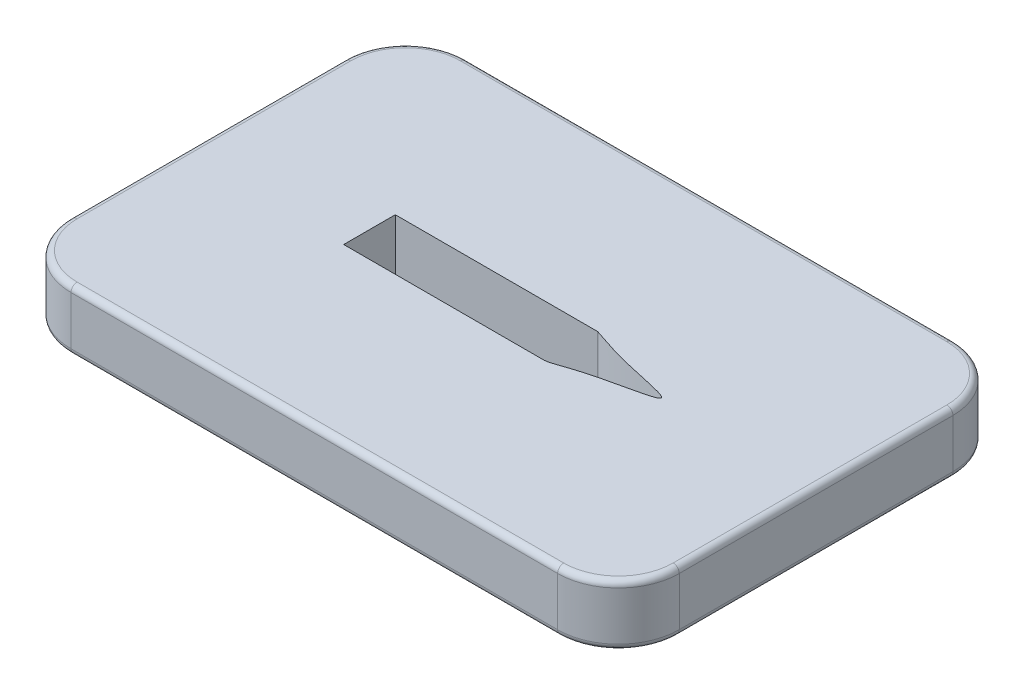
ISO-10303-21;
HEADER;
FILE_DESCRIPTION(('STEP AP214'),'2;1');
FILE_NAME('part.step','',(''),(''),'','','');
FILE_SCHEMA(('AUTOMOTIVE_DESIGN { 1 0 10303 214 1 1 1 1 }'));
ENDSEC;
DATA;
#1=APPLICATION_CONTEXT('core data for automotive mechanical design processes');
#2=APPLICATION_PROTOCOL_DEFINITION('international standard','automotive_design',2000,#1);
#3=PRODUCT_CONTEXT('',#1,'mechanical');
#4=PRODUCT('Part','Part','',(#3));
#5=PRODUCT_RELATED_PRODUCT_CATEGORY('part','',(#4));
#6=PRODUCT_DEFINITION_FORMATION('','',#4);
#7=PRODUCT_DEFINITION_CONTEXT('part definition',#1,'design');
#8=PRODUCT_DEFINITION('design','',#6,#7);
#9=PRODUCT_DEFINITION_SHAPE('','',#8);
#10=(LENGTH_UNIT() NAMED_UNIT(*) SI_UNIT(.MILLI.,.METRE.));
#11=(NAMED_UNIT(*) PLANE_ANGLE_UNIT() SI_UNIT($,.RADIAN.));
#12=(NAMED_UNIT(*) SI_UNIT($,.STERADIAN.) SOLID_ANGLE_UNIT());
#13=UNCERTAINTY_MEASURE_WITH_UNIT(LENGTH_MEASURE(1.E-05),#10,'distance_accuracy_value','');
#14=(GEOMETRIC_REPRESENTATION_CONTEXT(3) GLOBAL_UNCERTAINTY_ASSIGNED_CONTEXT((#13)) GLOBAL_UNIT_ASSIGNED_CONTEXT((#10,
#11,#12)) REPRESENTATION_CONTEXT('',''));
#15=CARTESIAN_POINT('',(0.,0.,0.));
#16=DIRECTION('',(0.,0.,1.));
#17=DIRECTION('',(1.,0.,0.));
#18=AXIS2_PLACEMENT_3D('',#15,#16,#17);
#19=CARTESIAN_POINT('',(-22.947041379712,10.,-16.4705882352941));
#20=DIRECTION('',(0.,-1.,0.));
#21=DIRECTION('',(0.,0.,-1.));
#22=AXIS2_PLACEMENT_3D('',#19,#20,#21);
#23=CYLINDRICAL_SURFACE('',#22,10.);
#24=DIRECTION('',(0.,-1.,0.));
#25=VECTOR('',#24,1.);
#26=CARTESIAN_POINT('',(-12.947041379712,10.,-16.470588235294));
#27=LINE('',#26,#25);
#28=CARTESIAN_POINT('',(-12.947041379712,9.,-16.470588235294));
#29=VERTEX_POINT('',#28);
#30=CARTESIAN_POINT('',(-12.947041379712,0.999999999999999,-16.470588235294));
#31=VERTEX_POINT('',#30);
#32=EDGE_CURVE('E482',#29,#31,#27,.T.);
#33=ORIENTED_EDGE('',*,*,#32,.T.);
#34=CARTESIAN_POINT('',(-22.947041379712,0.999999999999999,-16.4705882352941));
#35=DIRECTION('',(0.,-1.,0.));
#36=DIRECTION('',(0.,0.,-1.));
#37=AXIS2_PLACEMENT_3D('',#34,#35,#36);
#38=CIRCLE('',#37,10.);
#39=CARTESIAN_POINT('',(-22.9470413797121,0.999999999999999,-26.4705882352941));
#40=VERTEX_POINT('',#39);
#41=EDGE_CURVE('E408',#31,#40,#38,.F.);
#42=ORIENTED_EDGE('',*,*,#41,.T.);
#43=DIRECTION('',(0.,-1.,0.));
#44=VECTOR('',#43,1.);
#45=CARTESIAN_POINT('',(-22.9470413797121,10.,-26.4705882352941));
#46=LINE('',#45,#44);
#47=CARTESIAN_POINT('',(-22.9470413797121,9.,-26.4705882352941));
#48=VERTEX_POINT('',#47);
#49=EDGE_CURVE('E464',#48,#40,#46,.T.);
#50=ORIENTED_EDGE('',*,*,#49,.F.);
#51=CARTESIAN_POINT('',(-22.947041379712,9.,-16.4705882352941));
#52=DIRECTION('',(0.,-1.,0.));
#53=DIRECTION('',(0.,0.,-1.));
#54=AXIS2_PLACEMENT_3D('',#51,#52,#53);
#55=CIRCLE('',#54,10.);
#56=EDGE_CURVE('E436',#48,#29,#55,.T.);
#57=ORIENTED_EDGE('',*,*,#56,.T.);
#58=EDGE_LOOP('',(#33,#42,#50,#57));
#59=FACE_BOUND('',#58,.T.);
#60=ADVANCED_FACE('F44',(#59),#23,.T.);
#61=CARTESIAN_POINT('',(-102.947041379712,10.,-26.4705882352941));
#62=DIRECTION('',(0.,0.,1.));
#63=DIRECTION('',(1.,0.,0.));
#64=AXIS2_PLACEMENT_3D('',#61,#62,#63);
#65=PLANE('',#64);
#66=ORIENTED_EDGE('',*,*,#49,.T.);
#67=DIRECTION('',(-1.,0.,0.));
#68=VECTOR('',#67,1.);
#69=CARTESIAN_POINT('',(-102.947041379712,0.999999999999999,-26.4705882352941));
#70=LINE('',#69,#68);
#71=CARTESIAN_POINT('',(-102.947041379712,0.999999999999999,-26.4705882352941));
#72=VERTEX_POINT('',#71);
#73=EDGE_CURVE('E11',#40,#72,#70,.T.);
#74=ORIENTED_EDGE('',*,*,#73,.T.);
#75=DIRECTION('',(0.,-1.,0.));
#76=VECTOR('',#75,1.);
#77=CARTESIAN_POINT('',(-102.947041379712,10.,-26.4705882352941));
#78=LINE('',#77,#76);
#79=CARTESIAN_POINT('',(-102.947041379712,9.,-26.4705882352941));
#80=VERTEX_POINT('',#79);
#81=EDGE_CURVE('E466',#80,#72,#78,.T.);
#82=ORIENTED_EDGE('',*,*,#81,.F.);
#83=DIRECTION('',(-1.,0.,0.));
#84=VECTOR('',#83,1.);
#85=CARTESIAN_POINT('',(-102.947041379712,9.,-26.4705882352941));
#86=LINE('',#85,#84);
#87=EDGE_CURVE('E438',#80,#48,#86,.F.);
#88=ORIENTED_EDGE('',*,*,#87,.T.);
#89=EDGE_LOOP('',(#66,#74,#82,#88));
#90=FACE_BOUND('',#89,.T.);
#91=ADVANCED_FACE('F281',(#90),#65,.F.);
#92=CARTESIAN_POINT('',(-102.947041379712,10.,-16.4705882352941));
#93=DIRECTION('',(0.,-1.,0.));
#94=DIRECTION('',(0.,0.,-1.));
#95=AXIS2_PLACEMENT_3D('',#92,#93,#94);
#96=CYLINDRICAL_SURFACE('',#95,10.);
#97=ORIENTED_EDGE('',*,*,#81,.T.);
#98=CARTESIAN_POINT('',(-102.947041379712,0.999999999999999,-16.4705882352941));
#99=DIRECTION('',(0.,-1.,0.));
#100=DIRECTION('',(0.,0.,-1.));
#101=AXIS2_PLACEMENT_3D('',#98,#99,#100);
#102=CIRCLE('',#101,10.);
#103=CARTESIAN_POINT('',(-112.947041379712,0.999999999999999,-16.470588235294));
#104=VERTEX_POINT('',#103);
#105=EDGE_CURVE('E53',#72,#104,#102,.F.);
#106=ORIENTED_EDGE('',*,*,#105,.T.);
#107=DIRECTION('',(0.,-1.,0.));
#108=VECTOR('',#107,1.);
#109=CARTESIAN_POINT('',(-112.947041379712,10.,-16.470588235294));
#110=LINE('',#109,#108);
#111=CARTESIAN_POINT('',(-112.947041379712,9.,-16.470588235294));
#112=VERTEX_POINT('',#111);
#113=EDGE_CURVE('E468',#112,#104,#110,.T.);
#114=ORIENTED_EDGE('',*,*,#113,.F.);
#115=CARTESIAN_POINT('',(-102.947041379712,9.,-16.4705882352941));
#116=DIRECTION('',(0.,-1.,0.));
#117=DIRECTION('',(0.,0.,-1.));
#118=AXIS2_PLACEMENT_3D('',#115,#116,#117);
#119=CIRCLE('',#118,10.);
#120=EDGE_CURVE('E440',#112,#80,#119,.T.);
#121=ORIENTED_EDGE('',*,*,#120,.T.);
#122=EDGE_LOOP('',(#97,#106,#114,#121));
#123=FACE_BOUND('',#122,.T.);
#124=ADVANCED_FACE('F277',(#123),#96,.T.);
#125=CARTESIAN_POINT('',(-112.947041379712,10.,-16.470588235294));
#126=DIRECTION('',(1.,0.,0.));
#127=DIRECTION('',(0.,0.,-1.));
#128=AXIS2_PLACEMENT_3D('',#125,#126,#127);
#129=PLANE('',#128);
#130=ORIENTED_EDGE('',*,*,#113,.T.);
#131=DIRECTION('',(0.,0.,1.));
#132=VECTOR('',#131,1.);
#133=CARTESIAN_POINT('',(-112.947041379712,0.999999999999999,28.5294117647054));
#134=LINE('',#133,#132);
#135=CARTESIAN_POINT('',(-112.947041379712,0.999999999999999,28.5294117647054));
#136=VERTEX_POINT('',#135);
#137=EDGE_CURVE('E383',#104,#136,#134,.T.);
#138=ORIENTED_EDGE('',*,*,#137,.T.);
#139=DIRECTION('',(0.,-1.,0.));
#140=VECTOR('',#139,1.);
#141=CARTESIAN_POINT('',(-112.947041379712,10.,28.5294117647054));
#142=LINE('',#141,#140);
#143=CARTESIAN_POINT('',(-112.947041379712,9.,28.5294117647054));
#144=VERTEX_POINT('',#143);
#145=EDGE_CURVE('E470',#144,#136,#142,.T.);
#146=ORIENTED_EDGE('',*,*,#145,.F.);
#147=DIRECTION('',(0.,0.,1.));
#148=VECTOR('',#147,1.);
#149=CARTESIAN_POINT('',(-112.947041379712,9.,-16.470588235294));
#150=LINE('',#149,#148);
#151=EDGE_CURVE('E442',#144,#112,#150,.F.);
#152=ORIENTED_EDGE('',*,*,#151,.T.);
#153=EDGE_LOOP('',(#130,#138,#146,#152));
#154=FACE_BOUND('',#153,.T.);
#155=ADVANCED_FACE('F273',(#154),#129,.F.);
#156=CARTESIAN_POINT('',(-102.947041379712,10.,28.5294117647055));
#157=DIRECTION('',(0.,-1.,0.));
#158=DIRECTION('',(0.,0.,-1.));
#159=AXIS2_PLACEMENT_3D('',#156,#157,#158);
#160=CYLINDRICAL_SURFACE('',#159,10.);
#161=ORIENTED_EDGE('',*,*,#145,.T.);
#162=CARTESIAN_POINT('',(-102.947041379712,0.999999999999999,28.5294117647055));
#163=DIRECTION('',(0.,-1.,0.));
#164=DIRECTION('',(0.,0.,-1.));
#165=AXIS2_PLACEMENT_3D('',#162,#163,#164);
#166=CIRCLE('',#165,10.);
#167=CARTESIAN_POINT('',(-102.947041379712,0.999999999999999,38.5294117647055));
#168=VERTEX_POINT('',#167);
#169=EDGE_CURVE('E385',#136,#168,#166,.F.);
#170=ORIENTED_EDGE('',*,*,#169,.T.);
#171=DIRECTION('',(0.,-1.,0.));
#172=VECTOR('',#171,1.);
#173=CARTESIAN_POINT('',(-102.947041379712,10.,38.5294117647055));
#174=LINE('',#173,#172);
#175=CARTESIAN_POINT('',(-102.947041379712,9.,38.5294117647055));
#176=VERTEX_POINT('',#175);
#177=EDGE_CURVE('E473',#176,#168,#174,.T.);
#178=ORIENTED_EDGE('',*,*,#177,.F.);
#179=CARTESIAN_POINT('',(-102.947041379712,9.,28.5294117647055));
#180=DIRECTION('',(0.,-1.,0.));
#181=DIRECTION('',(0.,0.,-1.));
#182=AXIS2_PLACEMENT_3D('',#179,#180,#181);
#183=CIRCLE('',#182,10.);
#184=EDGE_CURVE('E444',#176,#144,#183,.T.);
#185=ORIENTED_EDGE('',*,*,#184,.T.);
#186=EDGE_LOOP('',(#161,#170,#178,#185));
#187=FACE_BOUND('',#186,.T.);
#188=ADVANCED_FACE('F269',(#187),#160,.T.);
#189=CARTESIAN_POINT('',(-102.947041379712,10.,38.5294117647055));
#190=DIRECTION('',(0.,0.,-1.));
#191=DIRECTION('',(-1.,0.,0.));
#192=AXIS2_PLACEMENT_3D('',#189,#190,#191);
#193=PLANE('',#192);
#194=ORIENTED_EDGE('',*,*,#177,.T.);
#195=DIRECTION('',(1.,0.,0.));
#196=VECTOR('',#195,1.);
#197=CARTESIAN_POINT('',(-22.9470413797121,0.999999999999999,38.5294117647055));
#198=LINE('',#197,#196);
#199=CARTESIAN_POINT('',(-22.9470413797121,0.999999999999999,38.5294117647055));
#200=VERTEX_POINT('',#199);
#201=EDGE_CURVE('E355',#168,#200,#198,.T.);
#202=ORIENTED_EDGE('',*,*,#201,.T.);
#203=DIRECTION('',(0.,-1.,0.));
#204=VECTOR('',#203,1.);
#205=CARTESIAN_POINT('',(-22.9470413797121,10.,38.5294117647055));
#206=LINE('',#205,#204);
#207=CARTESIAN_POINT('',(-22.9470413797121,9.,38.5294117647055));
#208=VERTEX_POINT('',#207);
#209=EDGE_CURVE('E476',#208,#200,#206,.T.);
#210=ORIENTED_EDGE('',*,*,#209,.F.);
#211=DIRECTION('',(1.,0.,0.));
#212=VECTOR('',#211,1.);
#213=CARTESIAN_POINT('',(-102.947041379712,9.,38.5294117647055));
#214=LINE('',#213,#212);
#215=EDGE_CURVE('E411',#208,#176,#214,.F.);
#216=ORIENTED_EDGE('',*,*,#215,.T.);
#217=EDGE_LOOP('',(#194,#202,#210,#216));
#218=FACE_BOUND('',#217,.T.);
#219=ADVANCED_FACE('F265',(#218),#193,.F.);
#220=CARTESIAN_POINT('',(-22.947041379712,10.,28.5294117647055));
#221=DIRECTION('',(0.,-1.,0.));
#222=DIRECTION('',(0.,0.,-1.));
#223=AXIS2_PLACEMENT_3D('',#220,#221,#222);
#224=CYLINDRICAL_SURFACE('',#223,10.);
#225=ORIENTED_EDGE('',*,*,#209,.T.);
#226=CARTESIAN_POINT('',(-22.947041379712,0.999999999999999,28.5294117647055));
#227=DIRECTION('',(0.,-1.,0.));
#228=DIRECTION('',(0.,0.,-1.));
#229=AXIS2_PLACEMENT_3D('',#226,#227,#228);
#230=CIRCLE('',#229,10.);
#231=CARTESIAN_POINT('',(-12.947041379712,0.999999999999999,28.5294117647054));
#232=VERTEX_POINT('',#231);
#233=EDGE_CURVE('E388',#200,#232,#230,.F.);
#234=ORIENTED_EDGE('',*,*,#233,.T.);
#235=DIRECTION('',(0.,-1.,0.));
#236=VECTOR('',#235,1.);
#237=CARTESIAN_POINT('',(-12.947041379712,10.,28.5294117647054));
#238=LINE('',#237,#236);
#239=CARTESIAN_POINT('',(-12.947041379712,9.,28.5294117647054));
#240=VERTEX_POINT('',#239);
#241=EDGE_CURVE('E479',#240,#232,#238,.T.);
#242=ORIENTED_EDGE('',*,*,#241,.F.);
#243=CARTESIAN_POINT('',(-22.947041379712,9.,28.5294117647055));
#244=DIRECTION('',(0.,-1.,0.));
#245=DIRECTION('',(0.,0.,-1.));
#246=AXIS2_PLACEMENT_3D('',#243,#244,#245);
#247=CIRCLE('',#246,10.);
#248=EDGE_CURVE('E432',#240,#208,#247,.T.);
#249=ORIENTED_EDGE('',*,*,#248,.T.);
#250=EDGE_LOOP('',(#225,#234,#242,#249));
#251=FACE_BOUND('',#250,.T.);
#252=ADVANCED_FACE('F261',(#251),#224,.T.);
#253=CARTESIAN_POINT('',(-12.947041379712,10.,-16.470588235294));
#254=DIRECTION('',(-1.,0.,0.));
#255=DIRECTION('',(0.,0.,1.));
#256=AXIS2_PLACEMENT_3D('',#253,#254,#255);
#257=PLANE('',#256);
#258=ORIENTED_EDGE('',*,*,#241,.T.);
#259=DIRECTION('',(0.,0.,-1.));
#260=VECTOR('',#259,1.);
#261=CARTESIAN_POINT('',(-12.947041379712,0.999999999999999,-16.470588235294));
#262=LINE('',#261,#260);
#263=EDGE_CURVE('E390',#232,#31,#262,.T.);
#264=ORIENTED_EDGE('',*,*,#263,.T.);
#265=ORIENTED_EDGE('',*,*,#32,.F.);
#266=DIRECTION('',(0.,0.,-1.));
#267=VECTOR('',#266,1.);
#268=CARTESIAN_POINT('',(-12.947041379712,9.,-16.470588235294));
#269=LINE('',#268,#267);
#270=EDGE_CURVE('E434',#29,#240,#269,.F.);
#271=ORIENTED_EDGE('',*,*,#270,.T.);
#272=EDGE_LOOP('',(#258,#264,#265,#271));
#273=FACE_BOUND('',#272,.T.);
#274=ADVANCED_FACE('F254',(#273),#257,.F.);
#275=CARTESIAN_POINT('',(-22.947041379712,10.,-16.4705882352941));
#276=DIRECTION('',(0.,-1.,0.));
#277=DIRECTION('',(0.,0.,-1.));
#278=AXIS2_PLACEMENT_3D('',#275,#276,#277);
#279=PLANE('',#278);
#280=DIRECTION('',(0.,0.,1.));
#281=VECTOR('',#280,1.);
#282=CARTESIAN_POINT('',(-111.947041379712,10.,-16.4705882352941));
#283=LINE('',#282,#281);
#284=CARTESIAN_POINT('',(-111.947041379712,10.,-16.470588235294));
#285=VERTEX_POINT('',#284);
#286=CARTESIAN_POINT('',(-111.947041379712,10.,28.5294117647054));
#287=VERTEX_POINT('',#286);
#288=EDGE_CURVE('E450',#285,#287,#283,.T.);
#289=ORIENTED_EDGE('',*,*,#288,.T.);
#290=CARTESIAN_POINT('',(-102.947041379712,10.,28.5294117647055));
#291=DIRECTION('',(0.,-1.,0.));
#292=DIRECTION('',(0.,0.,-1.));
#293=AXIS2_PLACEMENT_3D('',#290,#291,#292);
#294=CIRCLE('',#293,9.);
#295=CARTESIAN_POINT('',(-102.947041379712,10.,37.5294117647055));
#296=VERTEX_POINT('',#295);
#297=EDGE_CURVE('E447',#287,#296,#294,.F.);
#298=ORIENTED_EDGE('',*,*,#297,.T.);
#299=DIRECTION('',(1.,0.,0.));
#300=VECTOR('',#299,1.);
#301=CARTESIAN_POINT('',(-22.947041379712,10.,37.5294117647055));
#302=LINE('',#301,#300);
#303=CARTESIAN_POINT('',(-22.9470413797121,10.,37.5294117647055));
#304=VERTEX_POINT('',#303);
#305=EDGE_CURVE('E462',#296,#304,#302,.T.);
#306=ORIENTED_EDGE('',*,*,#305,.T.);
#307=CARTESIAN_POINT('',(-22.947041379712,10.,28.5294117647055));
#308=DIRECTION('',(0.,-1.,0.));
#309=DIRECTION('',(0.,0.,-1.));
#310=AXIS2_PLACEMENT_3D('',#307,#308,#309);
#311=CIRCLE('',#310,9.);
#312=CARTESIAN_POINT('',(-13.947041379712,10.,28.5294117647054));
#313=VERTEX_POINT('',#312);
#314=EDGE_CURVE('E460',#304,#313,#311,.F.);
#315=ORIENTED_EDGE('',*,*,#314,.T.);
#316=DIRECTION('',(0.,0.,-1.));
#317=VECTOR('',#316,1.);
#318=CARTESIAN_POINT('',(-13.947041379712,10.,-16.4705882352941));
#319=LINE('',#318,#317);
#320=CARTESIAN_POINT('',(-13.947041379712,10.,-16.470588235294));
#321=VERTEX_POINT('',#320);
#322=EDGE_CURVE('E458',#313,#321,#319,.T.);
#323=ORIENTED_EDGE('',*,*,#322,.T.);
#324=CARTESIAN_POINT('',(-22.947041379712,10.,-16.4705882352941));
#325=DIRECTION('',(0.,-1.,0.));
#326=DIRECTION('',(0.,0.,-1.));
#327=AXIS2_PLACEMENT_3D('',#324,#325,#326);
#328=CIRCLE('',#327,9.);
#329=CARTESIAN_POINT('',(-22.9470413797121,10.,-25.4705882352941));
#330=VERTEX_POINT('',#329);
#331=EDGE_CURVE('E456',#321,#330,#328,.F.);
#332=ORIENTED_EDGE('',*,*,#331,.T.);
#333=DIRECTION('',(-1.,0.,0.));
#334=VECTOR('',#333,1.);
#335=CARTESIAN_POINT('',(-22.947041379712,10.,-25.4705882352941));
#336=LINE('',#335,#334);
#337=CARTESIAN_POINT('',(-102.947041379712,10.,-25.4705882352941));
#338=VERTEX_POINT('',#337);
#339=EDGE_CURVE('E454',#330,#338,#336,.T.);
#340=ORIENTED_EDGE('',*,*,#339,.T.);
#341=CARTESIAN_POINT('',(-102.947041379712,10.,-16.4705882352941));
#342=DIRECTION('',(0.,-1.,0.));
#343=DIRECTION('',(0.,0.,-1.));
#344=AXIS2_PLACEMENT_3D('',#341,#342,#343);
#345=CIRCLE('',#344,9.);
#346=EDGE_CURVE('E452',#338,#285,#345,.F.);
#347=ORIENTED_EDGE('',*,*,#346,.T.);
#348=EDGE_LOOP('',(#289,#298,#306,#315,#323,#332,#340,#347));
#349=FACE_BOUND('',#348,.T.);
#350=DIRECTION('',(1.,0.,0.));
#351=VECTOR('',#350,1.);
#352=CARTESIAN_POINT('',(-86.3741512636771,10.,10.2732965921658));
#353=LINE('',#352,#351);
#354=CARTESIAN_POINT('',(-86.3741512636771,10.,10.2732965921658));
#355=VERTEX_POINT('',#354);
#356=CARTESIAN_POINT('',(-53.4231390678876,10.,10.2732965921658));
#357=VERTEX_POINT('',#356);
#358=EDGE_CURVE('E514',#355,#357,#353,.T.);
#359=ORIENTED_EDGE('',*,*,#358,.F.);
#360=DIRECTION('',(0.,0.,1.));
#361=VECTOR('',#360,1.);
#362=CARTESIAN_POINT('',(-86.3741512636771,10.,1.78552694124163));
#363=LINE('',#362,#361);
#364=CARTESIAN_POINT('',(-86.3741512636771,10.,1.78552694124163));
#365=VERTEX_POINT('',#364);
#366=EDGE_CURVE('E202',#365,#355,#363,.T.);
#367=ORIENTED_EDGE('',*,*,#366,.F.);
#368=DIRECTION('',(1.,0.,0.));
#369=VECTOR('',#368,1.);
#370=CARTESIAN_POINT('',(-86.3741512636771,10.,1.78552694124163));
#371=LINE('',#370,#369);
#372=CARTESIAN_POINT('',(-53.1559115649607,10.,1.78552694124163));
#373=VERTEX_POINT('',#372);
#374=EDGE_CURVE('E219',#365,#373,#371,.T.);
#375=ORIENTED_EDGE('',*,*,#374,.T.);
#376=CARTESIAN_POINT('',(-53.1559115649607,10.,1.78552694124163));
#377=CARTESIAN_POINT('',(-53.129080982494,10.,1.78938008632672));
#378=CARTESIAN_POINT('',(-53.1023158995604,10.,1.79328134778608));
#379=CARTESIAN_POINT('',(-53.0756073418984,10.,1.79723120744067));
#380=B_SPLINE_CURVE_WITH_KNOTS('',3,(#376,#377,#378,#379),.UNSPECIFIED.,.F.,.F.,(4,4),(0.,
0.000996400117936327),.UNSPECIFIED.);
#381=CARTESIAN_POINT('',(-53.0756073418984,10.,1.79723120744067));
#382=VERTEX_POINT('',#381);
#383=EDGE_CURVE('E222',#373,#382,#380,.T.);
#384=ORIENTED_EDGE('',*,*,#383,.T.);
#385=CARTESIAN_POINT('',(-53.0756073418984,10.,1.79723120744067));
#386=CARTESIAN_POINT('',(-51.5414857041665,10.,2.31674032644246));
#387=CARTESIAN_POINT('',(-45.4156020228323,10.,4.42244429270034));
#388=CARTESIAN_POINT('',(-33.3212391013097,10.,6.01523887983662));
#389=CARTESIAN_POINT('',(-45.2495627145046,10.,7.63943210245453));
#390=CARTESIAN_POINT('',(-51.251453322403,10.,9.67846550374859));
#391=CARTESIAN_POINT('',(-52.6935705394928,10.,10.167430321721));
#392=B_SPLINE_CURVE_WITH_KNOTS('',3,(#385,#386,#387,#388,#389,#390,#391),.UNSPECIFIED.,.F.,.F.,
(4,1,1,1,4),(0.,0.0633445722577171,0.236845360334493,0.409375210494384,0.468351291668037),.UNSPECIFIED.);
#393=CARTESIAN_POINT('',(-52.6935705394928,10.,10.167430321721));
#394=VERTEX_POINT('',#393);
#395=EDGE_CURVE('E498',#382,#394,#392,.T.);
#396=ORIENTED_EDGE('',*,*,#395,.T.);
#397=CARTESIAN_POINT('',(-52.6935705394928,10.,10.167430321721));
#398=CARTESIAN_POINT('',(-52.9330802293146,10.,10.2067332113804));
#399=CARTESIAN_POINT('',(-53.1753723895579,10.,10.242094783313));
#400=CARTESIAN_POINT('',(-53.4231390678876,10.,10.2732965921658));
#401=B_SPLINE_CURVE_WITH_KNOTS('',3,(#397,#398,#399,#400),.UNSPECIFIED.,.F.,.F.,(4,4),
(0.314143829827868,0.323514460727352),.UNSPECIFIED.);
#402=EDGE_CURVE('E506',#394,#357,#401,.T.);
#403=ORIENTED_EDGE('',*,*,#402,.T.);
#404=EDGE_LOOP('',(#359,#367,#375,#384,#396,#403));
#405=FACE_BOUND('',#404,.T.);
#406=ADVANCED_FACE('F251',(#349,#405),#279,.F.);
#407=CARTESIAN_POINT('',(-22.947041379712,0.,-16.4705882352941));
#408=DIRECTION('',(0.,-1.,0.));
#409=DIRECTION('',(0.,0.,-1.));
#410=AXIS2_PLACEMENT_3D('',#407,#408,#409);
#411=PLANE('',#410);
#412=DIRECTION('',(-1.,0.,0.));
#413=VECTOR('',#412,1.);
#414=CARTESIAN_POINT('',(-22.9470413797121,0.,-25.4705882352941));
#415=LINE('',#414,#413);
#416=CARTESIAN_POINT('',(-102.947041379712,0.,-25.4705882352941));
#417=VERTEX_POINT('',#416);
#418=CARTESIAN_POINT('',(-22.9470413797121,0.,-25.4705882352941));
#419=VERTEX_POINT('',#418);
#420=EDGE_CURVE('E406',#417,#419,#415,.F.);
#421=ORIENTED_EDGE('',*,*,#420,.T.);
#422=CARTESIAN_POINT('',(-22.947041379712,0.,-16.4705882352941));
#423=DIRECTION('',(0.,-1.,0.));
#424=DIRECTION('',(0.,0.,-1.));
#425=AXIS2_PLACEMENT_3D('',#422,#423,#424);
#426=CIRCLE('',#425,9.);
#427=CARTESIAN_POINT('',(-13.947041379712,0.,-16.470588235294));
#428=VERTEX_POINT('',#427);
#429=EDGE_CURVE('E392',#419,#428,#426,.T.);
#430=ORIENTED_EDGE('',*,*,#429,.T.);
#431=DIRECTION('',(0.,0.,-1.));
#432=VECTOR('',#431,1.);
#433=CARTESIAN_POINT('',(-13.947041379712,0.,28.5294117647054));
#434=LINE('',#433,#432);
#435=CARTESIAN_POINT('',(-13.947041379712,0.,28.5294117647054));
#436=VERTEX_POINT('',#435);
#437=EDGE_CURVE('E395',#428,#436,#434,.F.);
#438=ORIENTED_EDGE('',*,*,#437,.T.);
#439=CARTESIAN_POINT('',(-22.947041379712,0.,28.5294117647055));
#440=DIRECTION('',(0.,-1.,0.));
#441=DIRECTION('',(0.,0.,-1.));
#442=AXIS2_PLACEMENT_3D('',#439,#440,#441);
#443=CIRCLE('',#442,9.);
#444=CARTESIAN_POINT('',(-22.9470413797121,0.,37.5294117647055));
#445=VERTEX_POINT('',#444);
#446=EDGE_CURVE('E397',#436,#445,#443,.T.);
#447=ORIENTED_EDGE('',*,*,#446,.T.);
#448=DIRECTION('',(1.,0.,0.));
#449=VECTOR('',#448,1.);
#450=CARTESIAN_POINT('',(-102.947041379712,0.,37.5294117647055));
#451=LINE('',#450,#449);
#452=CARTESIAN_POINT('',(-102.947041379712,0.,37.5294117647055));
#453=VERTEX_POINT('',#452);
#454=EDGE_CURVE('E353',#445,#453,#451,.F.);
#455=ORIENTED_EDGE('',*,*,#454,.T.);
#456=CARTESIAN_POINT('',(-102.947041379712,0.,28.5294117647055));
#457=DIRECTION('',(0.,-1.,0.));
#458=DIRECTION('',(0.,0.,-1.));
#459=AXIS2_PLACEMENT_3D('',#456,#457,#458);
#460=CIRCLE('',#459,9.);
#461=CARTESIAN_POINT('',(-111.947041379712,0.,28.5294117647054));
#462=VERTEX_POINT('',#461);
#463=EDGE_CURVE('E400',#453,#462,#460,.T.);
#464=ORIENTED_EDGE('',*,*,#463,.T.);
#465=DIRECTION('',(0.,0.,1.));
#466=VECTOR('',#465,1.);
#467=CARTESIAN_POINT('',(-111.947041379712,0.,-16.470588235294));
#468=LINE('',#467,#466);
#469=CARTESIAN_POINT('',(-111.947041379712,0.,-16.470588235294));
#470=VERTEX_POINT('',#469);
#471=EDGE_CURVE('E402',#462,#470,#468,.F.);
#472=ORIENTED_EDGE('',*,*,#471,.T.);
#473=CARTESIAN_POINT('',(-102.947041379712,0.,-16.4705882352941));
#474=DIRECTION('',(0.,-1.,0.));
#475=DIRECTION('',(0.,0.,-1.));
#476=AXIS2_PLACEMENT_3D('',#473,#474,#475);
#477=CIRCLE('',#476,9.);
#478=EDGE_CURVE('E404',#470,#417,#477,.T.);
#479=ORIENTED_EDGE('',*,*,#478,.T.);
#480=EDGE_LOOP('',(#421,#430,#438,#447,#455,#464,#472,#479));
#481=FACE_BOUND('',#480,.T.);
#482=DIRECTION('',(0.,0.,1.));
#483=VECTOR('',#482,1.);
#484=CARTESIAN_POINT('',(-86.3741512636771,0.,1.78552694124163));
#485=LINE('',#484,#483);
#486=CARTESIAN_POINT('',(-86.3741512636771,0.,1.78552694124163));
#487=VERTEX_POINT('',#486);
#488=CARTESIAN_POINT('',(-86.3741512636771,0.,10.2732965921658));
#489=VERTEX_POINT('',#488);
#490=EDGE_CURVE('E199',#487,#489,#485,.T.);
#491=ORIENTED_EDGE('',*,*,#490,.T.);
#492=DIRECTION('',(1.,0.,0.));
#493=VECTOR('',#492,1.);
#494=CARTESIAN_POINT('',(-86.3741512636771,0.,10.2732965921658));
#495=LINE('',#494,#493);
#496=CARTESIAN_POINT('',(-53.4231390678876,0.,10.2732965921658));
#497=VERTEX_POINT('',#496);
#498=EDGE_CURVE('E210',#489,#497,#495,.T.);
#499=ORIENTED_EDGE('',*,*,#498,.T.);
#500=CARTESIAN_POINT('',(-52.6935705394928,0.,10.167430321721));
#501=CARTESIAN_POINT('',(-52.9330802293146,0.,10.2067332113804));
#502=CARTESIAN_POINT('',(-53.1753723895579,0.,10.242094783313));
#503=CARTESIAN_POINT('',(-53.4231390678876,0.,10.2732965921658));
#504=B_SPLINE_CURVE_WITH_KNOTS('',3,(#500,#501,#502,#503),.UNSPECIFIED.,.F.,.F.,(4,4),
(0.314143829827868,0.323514460727352),.UNSPECIFIED.);
#505=CARTESIAN_POINT('',(-52.6935705394928,0.,10.167430321721));
#506=VERTEX_POINT('',#505);
#507=EDGE_CURVE('E215',#506,#497,#504,.T.);
#508=ORIENTED_EDGE('',*,*,#507,.F.);
#509=CARTESIAN_POINT('',(-53.0756073418984,0.,1.79723120744067));
#510=CARTESIAN_POINT('',(-51.5414857041665,0.,2.31674032644246));
#511=CARTESIAN_POINT('',(-45.4156020228323,0.,4.42244429270034));
#512=CARTESIAN_POINT('',(-33.3212391013097,0.,6.01523887983662));
#513=CARTESIAN_POINT('',(-45.2495627145046,0.,7.63943210245453));
#514=CARTESIAN_POINT('',(-51.251453322403,0.,9.67846550374859));
#515=CARTESIAN_POINT('',(-52.6935705394928,0.,10.167430321721));
#516=B_SPLINE_CURVE_WITH_KNOTS('',3,(#509,#510,#511,#512,#513,#514,#515),.UNSPECIFIED.,.F.,.F.,
(4,1,1,1,4),(0.,0.0633445722577171,0.236845360334493,0.409375210494384,0.468351291668037),.UNSPECIFIED.);
#517=CARTESIAN_POINT('',(-53.0756073418984,0.,1.79723120744067));
#518=VERTEX_POINT('',#517);
#519=EDGE_CURVE('E229',#518,#506,#516,.T.);
#520=ORIENTED_EDGE('',*,*,#519,.F.);
#521=CARTESIAN_POINT('',(-53.1559115649607,0.,1.78552694124163));
#522=CARTESIAN_POINT('',(-53.129080982494,0.,1.78938008632672));
#523=CARTESIAN_POINT('',(-53.1023158995604,0.,1.79328134778608));
#524=CARTESIAN_POINT('',(-53.0756073418984,0.,1.79723120744067));
#525=B_SPLINE_CURVE_WITH_KNOTS('',3,(#521,#522,#523,#524),.UNSPECIFIED.,.F.,.F.,(4,4),(0.,
0.000996400117936327),.UNSPECIFIED.);
#526=CARTESIAN_POINT('',(-53.1559115649607,0.,1.78552694124163));
#527=VERTEX_POINT('',#526);
#528=EDGE_CURVE('E520',#527,#518,#525,.T.);
#529=ORIENTED_EDGE('',*,*,#528,.F.);
#530=DIRECTION('',(1.,0.,0.));
#531=VECTOR('',#530,1.);
#532=CARTESIAN_POINT('',(-86.3741512636771,0.,1.78552694124163));
#533=LINE('',#532,#531);
#534=EDGE_CURVE('E207',#487,#527,#533,.T.);
#535=ORIENTED_EDGE('',*,*,#534,.F.);
#536=EDGE_LOOP('',(#491,#499,#508,#520,#529,#535));
#537=FACE_BOUND('',#536,.T.);
#538=ADVANCED_FACE('F217',(#481,#537),#411,.T.);
#539=CARTESIAN_POINT('',(-86.3741512636771,0.,1.78552694124163));
#540=DIRECTION('',(-1.,0.,0.));
#541=DIRECTION('',(0.,0.,1.));
#542=AXIS2_PLACEMENT_3D('',#539,#540,#541);
#543=PLANE('',#542);
#544=ORIENTED_EDGE('',*,*,#366,.T.);
#545=DIRECTION('',(0.,1.,0.));
#546=VECTOR('',#545,1.);
#547=CARTESIAN_POINT('',(-86.3741512636771,0.,10.2732965921658));
#548=LINE('',#547,#546);
#549=EDGE_CURVE('E195',#489,#355,#548,.T.);
#550=ORIENTED_EDGE('',*,*,#549,.F.);
#551=ORIENTED_EDGE('',*,*,#490,.F.);
#552=DIRECTION('',(0.,1.,0.));
#553=VECTOR('',#552,1.);
#554=CARTESIAN_POINT('',(-86.3741512636771,0.,1.78552694124163));
#555=LINE('',#554,#553);
#556=EDGE_CURVE('E484',#487,#365,#555,.T.);
#557=ORIENTED_EDGE('',*,*,#556,.T.);
#558=EDGE_LOOP('',(#544,#550,#551,#557));
#559=FACE_BOUND('',#558,.T.);
#560=ADVANCED_FACE('F197',(#559),#543,.F.);
#561=CARTESIAN_POINT('',(-86.3741512636771,0.,1.78552694124163));
#562=DIRECTION('',(0.,0.,1.));
#563=DIRECTION('',(1.,0.,0.));
#564=AXIS2_PLACEMENT_3D('',#561,#562,#563);
#565=PLANE('',#564);
#566=ORIENTED_EDGE('',*,*,#374,.F.);
#567=ORIENTED_EDGE('',*,*,#556,.F.);
#568=ORIENTED_EDGE('',*,*,#534,.T.);
#569=DIRECTION('',(0.,1.,0.));
#570=VECTOR('',#569,1.);
#571=CARTESIAN_POINT('',(-53.1559115649607,0.,1.78552694124163));
#572=LINE('',#571,#570);
#573=EDGE_CURVE('E491',#527,#373,#572,.T.);
#574=ORIENTED_EDGE('',*,*,#573,.T.);
#575=EDGE_LOOP('',(#566,#567,#568,#574));
#576=FACE_BOUND('',#575,.T.);
#577=ADVANCED_FACE('F250',(#576),#565,.T.);
#578=DIRECTION('',(0.,1.,0.));
#579=VECTOR('',#578,1.);
#580=SURFACE_OF_LINEAR_EXTRUSION('',#525,#579);
#581=ORIENTED_EDGE('',*,*,#383,.F.);
#582=ORIENTED_EDGE('',*,*,#573,.F.);
#583=ORIENTED_EDGE('',*,*,#528,.T.);
#584=DIRECTION('',(0.,1.,0.));
#585=VECTOR('',#584,1.);
#586=CARTESIAN_POINT('',(-53.0756073418984,0.,1.79723120744067));
#587=LINE('',#586,#585);
#588=EDGE_CURVE('E489',#518,#382,#587,.T.);
#589=ORIENTED_EDGE('',*,*,#588,.T.);
#590=EDGE_LOOP('',(#581,#582,#583,#589));
#591=FACE_BOUND('',#590,.T.);
#592=ADVANCED_FACE('F527',(#591),#580,.T.);
#593=DIRECTION('',(0.,1.,0.));
#594=VECTOR('',#593,1.);
#595=SURFACE_OF_LINEAR_EXTRUSION('',#516,#594);
#596=ORIENTED_EDGE('',*,*,#395,.F.);
#597=ORIENTED_EDGE('',*,*,#588,.F.);
#598=ORIENTED_EDGE('',*,*,#519,.T.);
#599=DIRECTION('',(0.,1.,0.));
#600=VECTOR('',#599,1.);
#601=CARTESIAN_POINT('',(-52.6935705394928,0.,10.167430321721));
#602=LINE('',#601,#600);
#603=EDGE_CURVE('E487',#506,#394,#602,.T.);
#604=ORIENTED_EDGE('',*,*,#603,.T.);
#605=EDGE_LOOP('',(#596,#597,#598,#604));
#606=FACE_BOUND('',#605,.T.);
#607=ADVANCED_FACE('F242',(#606),#595,.T.);
#608=DIRECTION('',(0.,1.,0.));
#609=VECTOR('',#608,1.);
#610=SURFACE_OF_LINEAR_EXTRUSION('',#504,#609);
#611=ORIENTED_EDGE('',*,*,#402,.F.);
#612=ORIENTED_EDGE('',*,*,#603,.F.);
#613=ORIENTED_EDGE('',*,*,#507,.T.);
#614=DIRECTION('',(0.,1.,0.));
#615=VECTOR('',#614,1.);
#616=CARTESIAN_POINT('',(-53.4231390678876,0.,10.2732965921658));
#617=LINE('',#616,#615);
#618=EDGE_CURVE('E206',#497,#357,#617,.T.);
#619=ORIENTED_EDGE('',*,*,#618,.T.);
#620=EDGE_LOOP('',(#611,#612,#613,#619));
#621=FACE_BOUND('',#620,.T.);
#622=ADVANCED_FACE('F238',(#621),#610,.T.);
#623=CARTESIAN_POINT('',(-86.3741512636771,0.,10.2732965921658));
#624=DIRECTION('',(0.,0.,1.));
#625=DIRECTION('',(1.,0.,0.));
#626=AXIS2_PLACEMENT_3D('',#623,#624,#625);
#627=PLANE('',#626);
#628=ORIENTED_EDGE('',*,*,#358,.T.);
#629=ORIENTED_EDGE('',*,*,#618,.F.);
#630=ORIENTED_EDGE('',*,*,#498,.F.);
#631=ORIENTED_EDGE('',*,*,#549,.T.);
#632=EDGE_LOOP('',(#628,#629,#630,#631));
#633=FACE_BOUND('',#632,.T.);
#634=ADVANCED_FACE('F211',(#633),#627,.F.);
#635=CARTESIAN_POINT('',(-22.947041379712,9.,-16.4705882352941));
#636=DIRECTION('',(0.,-1.,0.));
#637=DIRECTION('',(0.,0.,-1.));
#638=AXIS2_PLACEMENT_3D('',#635,#636,#637);
#639=TOROIDAL_SURFACE('',#638,9.,1.);
#640=CARTESIAN_POINT('',(-13.947041379712,9.,-16.470588235294));
#641=DIRECTION('',(0.,0.,1.));
#642=DIRECTION('',(1.,0.,0.));
#643=AXIS2_PLACEMENT_3D('',#640,#641,#642);
#644=CIRCLE('',#643,1.);
#645=EDGE_CURVE('E415',#29,#321,#644,.T.);
#646=ORIENTED_EDGE('',*,*,#645,.F.);
#647=ORIENTED_EDGE('',*,*,#56,.F.);
#648=CARTESIAN_POINT('',(-22.9470413797121,9.,-25.4705882352941));
#649=DIRECTION('',(-1.,0.,0.));
#650=DIRECTION('',(0.,0.,1.));
#651=AXIS2_PLACEMENT_3D('',#648,#649,#650);
#652=CIRCLE('',#651,1.);
#653=EDGE_CURVE('E412',#330,#48,#652,.T.);
#654=ORIENTED_EDGE('',*,*,#653,.F.);
#655=ORIENTED_EDGE('',*,*,#331,.F.);
#656=EDGE_LOOP('',(#646,#647,#654,#655));
#657=FACE_BOUND('',#656,.T.);
#658=ADVANCED_FACE('F247',(#657),#639,.T.);
#659=CARTESIAN_POINT('',(-22.947041379712,9.,-25.4705882352941));
#660=DIRECTION('',(-1.,0.,0.));
#661=DIRECTION('',(0.,0.,1.));
#662=AXIS2_PLACEMENT_3D('',#659,#660,#661);
#663=CYLINDRICAL_SURFACE('',#662,1.);
#664=ORIENTED_EDGE('',*,*,#653,.T.);
#665=ORIENTED_EDGE('',*,*,#87,.F.);
#666=CARTESIAN_POINT('',(-102.947041379712,9.,-25.4705882352941));
#667=DIRECTION('',(-1.,0.,0.));
#668=DIRECTION('',(0.,0.,1.));
#669=AXIS2_PLACEMENT_3D('',#666,#667,#668);
#670=CIRCLE('',#669,1.);
#671=EDGE_CURVE('E418',#338,#80,#670,.T.);
#672=ORIENTED_EDGE('',*,*,#671,.F.);
#673=ORIENTED_EDGE('',*,*,#339,.F.);
#674=EDGE_LOOP('',(#664,#665,#672,#673));
#675=FACE_BOUND('',#674,.T.);
#676=ADVANCED_FACE('F310',(#675),#663,.T.);
#677=CARTESIAN_POINT('',(-13.947041379712,9.,-16.4705882352941));
#678=DIRECTION('',(0.,0.,-1.));
#679=DIRECTION('',(-1.,0.,0.));
#680=AXIS2_PLACEMENT_3D('',#677,#678,#679);
#681=CYLINDRICAL_SURFACE('',#680,1.);
#682=ORIENTED_EDGE('',*,*,#645,.T.);
#683=ORIENTED_EDGE('',*,*,#322,.F.);
#684=CARTESIAN_POINT('',(-13.947041379712,9.,28.5294117647054));
#685=DIRECTION('',(0.,0.,1.));
#686=DIRECTION('',(1.,0.,0.));
#687=AXIS2_PLACEMENT_3D('',#684,#685,#686);
#688=CIRCLE('',#687,1.);
#689=EDGE_CURVE('E421',#240,#313,#688,.T.);
#690=ORIENTED_EDGE('',*,*,#689,.F.);
#691=ORIENTED_EDGE('',*,*,#270,.F.);
#692=EDGE_LOOP('',(#682,#683,#690,#691));
#693=FACE_BOUND('',#692,.T.);
#694=ADVANCED_FACE('F306',(#693),#681,.T.);
#695=CARTESIAN_POINT('',(-102.947041379712,9.,-16.4705882352941));
#696=DIRECTION('',(0.,-1.,0.));
#697=DIRECTION('',(0.,0.,-1.));
#698=AXIS2_PLACEMENT_3D('',#695,#696,#697);
#699=TOROIDAL_SURFACE('',#698,9.,1.);
#700=ORIENTED_EDGE('',*,*,#671,.T.);
#701=ORIENTED_EDGE('',*,*,#120,.F.);
#702=CARTESIAN_POINT('',(-111.947041379712,9.,-16.470588235294));
#703=DIRECTION('',(0.,0.,1.));
#704=DIRECTION('',(1.,0.,0.));
#705=AXIS2_PLACEMENT_3D('',#702,#703,#704);
#706=CIRCLE('',#705,1.);
#707=EDGE_CURVE('E424',#285,#112,#706,.T.);
#708=ORIENTED_EDGE('',*,*,#707,.F.);
#709=ORIENTED_EDGE('',*,*,#346,.F.);
#710=EDGE_LOOP('',(#700,#701,#708,#709));
#711=FACE_BOUND('',#710,.T.);
#712=ADVANCED_FACE('F302',(#711),#699,.T.);
#713=CARTESIAN_POINT('',(-22.947041379712,9.,28.5294117647055));
#714=DIRECTION('',(0.,-1.,0.));
#715=DIRECTION('',(0.,0.,-1.));
#716=AXIS2_PLACEMENT_3D('',#713,#714,#715);
#717=TOROIDAL_SURFACE('',#716,9.,1.);
#718=ORIENTED_EDGE('',*,*,#689,.T.);
#719=ORIENTED_EDGE('',*,*,#314,.F.);
#720=CARTESIAN_POINT('',(-22.9470413797121,9.,37.5294117647055));
#721=DIRECTION('',(-1.,0.,0.));
#722=DIRECTION('',(0.,0.,1.));
#723=AXIS2_PLACEMENT_3D('',#720,#721,#722);
#724=CIRCLE('',#723,1.);
#725=EDGE_CURVE('E427',#208,#304,#724,.T.);
#726=ORIENTED_EDGE('',*,*,#725,.F.);
#727=ORIENTED_EDGE('',*,*,#248,.F.);
#728=EDGE_LOOP('',(#718,#719,#726,#727));
#729=FACE_BOUND('',#728,.T.);
#730=ADVANCED_FACE('F298',(#729),#717,.T.);
#731=CARTESIAN_POINT('',(-111.947041379712,9.,-16.4705882352941));
#732=DIRECTION('',(0.,0.,1.));
#733=DIRECTION('',(1.,0.,0.));
#734=AXIS2_PLACEMENT_3D('',#731,#732,#733);
#735=CYLINDRICAL_SURFACE('',#734,1.);
#736=ORIENTED_EDGE('',*,*,#707,.T.);
#737=ORIENTED_EDGE('',*,*,#151,.F.);
#738=CARTESIAN_POINT('',(-111.947041379712,9.,28.5294117647054));
#739=DIRECTION('',(0.,0.,1.));
#740=DIRECTION('',(1.,0.,0.));
#741=AXIS2_PLACEMENT_3D('',#738,#739,#740);
#742=CIRCLE('',#741,1.);
#743=EDGE_CURVE('E360',#287,#144,#742,.T.);
#744=ORIENTED_EDGE('',*,*,#743,.F.);
#745=ORIENTED_EDGE('',*,*,#288,.F.);
#746=EDGE_LOOP('',(#736,#737,#744,#745));
#747=FACE_BOUND('',#746,.T.);
#748=ADVANCED_FACE('F294',(#747),#735,.T.);
#749=CARTESIAN_POINT('',(-22.947041379712,9.,37.5294117647055));
#750=DIRECTION('',(1.,0.,0.));
#751=DIRECTION('',(0.,0.,-1.));
#752=AXIS2_PLACEMENT_3D('',#749,#750,#751);
#753=CYLINDRICAL_SURFACE('',#752,1.);
#754=ORIENTED_EDGE('',*,*,#725,.T.);
#755=ORIENTED_EDGE('',*,*,#305,.F.);
#756=CARTESIAN_POINT('',(-102.947041379712,9.,37.5294117647055));
#757=DIRECTION('',(-1.,0.,0.));
#758=DIRECTION('',(0.,0.,1.));
#759=AXIS2_PLACEMENT_3D('',#756,#757,#758);
#760=CIRCLE('',#759,1.);
#761=EDGE_CURVE('E358',#176,#296,#760,.T.);
#762=ORIENTED_EDGE('',*,*,#761,.F.);
#763=ORIENTED_EDGE('',*,*,#215,.F.);
#764=EDGE_LOOP('',(#754,#755,#762,#763));
#765=FACE_BOUND('',#764,.T.);
#766=ADVANCED_FACE('F290',(#765),#753,.T.);
#767=CARTESIAN_POINT('',(-102.947041379712,9.,28.5294117647055));
#768=DIRECTION('',(0.,-1.,0.));
#769=DIRECTION('',(0.,0.,-1.));
#770=AXIS2_PLACEMENT_3D('',#767,#768,#769);
#771=TOROIDAL_SURFACE('',#770,9.,1.);
#772=ORIENTED_EDGE('',*,*,#743,.T.);
#773=ORIENTED_EDGE('',*,*,#184,.F.);
#774=ORIENTED_EDGE('',*,*,#761,.T.);
#775=ORIENTED_EDGE('',*,*,#297,.F.);
#776=EDGE_LOOP('',(#772,#773,#774,#775));
#777=FACE_BOUND('',#776,.T.);
#778=ADVANCED_FACE('F287',(#777),#771,.T.);
#779=CARTESIAN_POINT('',(-102.947041379712,0.999999999999999,28.5294117647055));
#780=DIRECTION('',(0.,-1.,0.));
#781=DIRECTION('',(0.,0.,-1.));
#782=AXIS2_PLACEMENT_3D('',#779,#780,#781);
#783=TOROIDAL_SURFACE('',#782,9.,1.);
#784=CARTESIAN_POINT('',(-111.947041379712,1.,28.5294117647054));
#785=DIRECTION('',(0.,0.,-1.));
#786=DIRECTION('',(-1.,0.,0.));
#787=AXIS2_PLACEMENT_3D('',#784,#785,#786);
#788=CIRCLE('',#787,1.);
#789=EDGE_CURVE('E359',#462,#136,#788,.T.);
#790=ORIENTED_EDGE('',*,*,#789,.F.);
#791=ORIENTED_EDGE('',*,*,#463,.F.);
#792=CARTESIAN_POINT('',(-102.947041379712,0.999999999999999,37.5294117647055));
#793=DIRECTION('',(1.,0.,0.));
#794=DIRECTION('',(0.,0.,-1.));
#795=AXIS2_PLACEMENT_3D('',#792,#793,#794);
#796=CIRCLE('',#795,1.);
#797=EDGE_CURVE('E48',#168,#453,#796,.T.);
#798=ORIENTED_EDGE('',*,*,#797,.F.);
#799=ORIENTED_EDGE('',*,*,#169,.F.);
#800=EDGE_LOOP('',(#790,#791,#798,#799));
#801=FACE_BOUND('',#800,.T.);
#802=ADVANCED_FACE('F46',(#801),#783,.T.);
#803=CARTESIAN_POINT('',(-102.947041379712,0.999999999999999,37.5294117647055));
#804=DIRECTION('',(-1.,0.,0.));
#805=DIRECTION('',(0.,0.,1.));
#806=AXIS2_PLACEMENT_3D('',#803,#804,#805);
#807=CYLINDRICAL_SURFACE('',#806,1.);
#808=ORIENTED_EDGE('',*,*,#797,.T.);
#809=ORIENTED_EDGE('',*,*,#454,.F.);
#810=CARTESIAN_POINT('',(-22.9470413797121,0.999999999999999,37.5294117647055));
#811=DIRECTION('',(1.,0.,0.));
#812=DIRECTION('',(0.,1.,0.));
#813=AXIS2_PLACEMENT_3D('',#810,#811,#812);
#814=CIRCLE('',#813,1.);
#815=EDGE_CURVE('E363',#200,#445,#814,.T.);
#816=ORIENTED_EDGE('',*,*,#815,.F.);
#817=ORIENTED_EDGE('',*,*,#201,.F.);
#818=EDGE_LOOP('',(#808,#809,#816,#817));
#819=FACE_BOUND('',#818,.T.);
#820=ADVANCED_FACE('F340',(#819),#807,.T.);
#821=CARTESIAN_POINT('',(-111.947041379712,0.999999999999999,-16.470588235294));
#822=DIRECTION('',(0.,0.,-1.));
#823=DIRECTION('',(-1.,0.,0.));
#824=AXIS2_PLACEMENT_3D('',#821,#822,#823);
#825=CYLINDRICAL_SURFACE('',#824,1.);
#826=ORIENTED_EDGE('',*,*,#789,.T.);
#827=ORIENTED_EDGE('',*,*,#137,.F.);
#828=CARTESIAN_POINT('',(-111.947041379712,1.,-16.470588235294));
#829=DIRECTION('',(0.,0.,-1.));
#830=DIRECTION('',(-1.,0.,0.));
#831=AXIS2_PLACEMENT_3D('',#828,#829,#830);
#832=CIRCLE('',#831,1.);
#833=EDGE_CURVE('E367',#470,#104,#832,.T.);
#834=ORIENTED_EDGE('',*,*,#833,.F.);
#835=ORIENTED_EDGE('',*,*,#471,.F.);
#836=EDGE_LOOP('',(#826,#827,#834,#835));
#837=FACE_BOUND('',#836,.T.);
#838=ADVANCED_FACE('F337',(#837),#825,.T.);
#839=CARTESIAN_POINT('',(-22.947041379712,0.999999999999999,28.5294117647055));
#840=DIRECTION('',(0.,-1.,0.));
#841=DIRECTION('',(0.,0.,-1.));
#842=AXIS2_PLACEMENT_3D('',#839,#840,#841);
#843=TOROIDAL_SURFACE('',#842,9.,1.);
#844=ORIENTED_EDGE('',*,*,#815,.T.);
#845=ORIENTED_EDGE('',*,*,#446,.F.);
#846=CARTESIAN_POINT('',(-13.947041379712,0.999999999999999,28.5294117647054));
#847=DIRECTION('',(0.,0.,-1.));
#848=DIRECTION('',(0.,1.,0.));
#849=AXIS2_PLACEMENT_3D('',#846,#847,#848);
#850=CIRCLE('',#849,1.);
#851=EDGE_CURVE('E372',#232,#436,#850,.T.);
#852=ORIENTED_EDGE('',*,*,#851,.F.);
#853=ORIENTED_EDGE('',*,*,#233,.F.);
#854=EDGE_LOOP('',(#844,#845,#852,#853));
#855=FACE_BOUND('',#854,.T.);
#856=ADVANCED_FACE('F333',(#855),#843,.T.);
#857=CARTESIAN_POINT('',(-102.947041379712,0.999999999999999,-16.4705882352941));
#858=DIRECTION('',(0.,-1.,0.));
#859=DIRECTION('',(0.,0.,-1.));
#860=AXIS2_PLACEMENT_3D('',#857,#858,#859);
#861=TOROIDAL_SURFACE('',#860,9.,1.);
#862=ORIENTED_EDGE('',*,*,#833,.T.);
#863=ORIENTED_EDGE('',*,*,#105,.F.);
#864=CARTESIAN_POINT('',(-102.947041379712,1.,-25.4705882352941));
#865=DIRECTION('',(1.,0.,0.));
#866=DIRECTION('',(0.,0.,-1.));
#867=AXIS2_PLACEMENT_3D('',#864,#865,#866);
#868=CIRCLE('',#867,1.);
#869=EDGE_CURVE('E375',#417,#72,#868,.T.);
#870=ORIENTED_EDGE('',*,*,#869,.F.);
#871=ORIENTED_EDGE('',*,*,#478,.F.);
#872=EDGE_LOOP('',(#862,#863,#870,#871));
#873=FACE_BOUND('',#872,.T.);
#874=ADVANCED_FACE('F329',(#873),#861,.T.);
#875=CARTESIAN_POINT('',(-13.947041379712,0.999999999999999,-16.470588235294));
#876=DIRECTION('',(0.,0.,1.));
#877=DIRECTION('',(1.,0.,0.));
#878=AXIS2_PLACEMENT_3D('',#875,#876,#877);
#879=CYLINDRICAL_SURFACE('',#878,1.);
#880=ORIENTED_EDGE('',*,*,#851,.T.);
#881=ORIENTED_EDGE('',*,*,#437,.F.);
#882=CARTESIAN_POINT('',(-13.947041379712,0.999999999999999,-16.470588235294));
#883=DIRECTION('',(0.,0.,-1.));
#884=DIRECTION('',(0.,1.,0.));
#885=AXIS2_PLACEMENT_3D('',#882,#883,#884);
#886=CIRCLE('',#885,1.);
#887=EDGE_CURVE('E378',#31,#428,#886,.T.);
#888=ORIENTED_EDGE('',*,*,#887,.F.);
#889=ORIENTED_EDGE('',*,*,#263,.F.);
#890=EDGE_LOOP('',(#880,#881,#888,#889));
#891=FACE_BOUND('',#890,.T.);
#892=ADVANCED_FACE('F325',(#891),#879,.T.);
#893=CARTESIAN_POINT('',(-102.947041379712,0.999999999999999,-25.4705882352941));
#894=DIRECTION('',(1.,0.,0.));
#895=DIRECTION('',(0.,0.,-1.));
#896=AXIS2_PLACEMENT_3D('',#893,#894,#895);
#897=CYLINDRICAL_SURFACE('',#896,1.);
#898=ORIENTED_EDGE('',*,*,#869,.T.);
#899=ORIENTED_EDGE('',*,*,#73,.F.);
#900=CARTESIAN_POINT('',(-22.9470413797121,1.,-25.4705882352941));
#901=DIRECTION('',(1.,0.,0.));
#902=DIRECTION('',(0.,0.,-1.));
#903=AXIS2_PLACEMENT_3D('',#900,#901,#902);
#904=CIRCLE('',#903,1.);
#905=EDGE_CURVE('E380',#419,#40,#904,.T.);
#906=ORIENTED_EDGE('',*,*,#905,.F.);
#907=ORIENTED_EDGE('',*,*,#420,.F.);
#908=EDGE_LOOP('',(#898,#899,#906,#907));
#909=FACE_BOUND('',#908,.T.);
#910=ADVANCED_FACE('F321',(#909),#897,.T.);
#911=CARTESIAN_POINT('',(-22.947041379712,0.999999999999999,-16.4705882352941));
#912=DIRECTION('',(0.,-1.,0.));
#913=DIRECTION('',(0.,0.,-1.));
#914=AXIS2_PLACEMENT_3D('',#911,#912,#913);
#915=TOROIDAL_SURFACE('',#914,9.,1.);
#916=ORIENTED_EDGE('',*,*,#887,.T.);
#917=ORIENTED_EDGE('',*,*,#429,.F.);
#918=ORIENTED_EDGE('',*,*,#905,.T.);
#919=ORIENTED_EDGE('',*,*,#41,.F.);
#920=EDGE_LOOP('',(#916,#917,#918,#919));
#921=FACE_BOUND('',#920,.T.);
#922=ADVANCED_FACE('F318',(#921),#915,.T.);
#923=CLOSED_SHELL('',(#60,#91,#124,#155,#188,#219,#252,#274,#406,#538,#560,#577,#592,#607,#622,
#634,#658,#676,#694,#712,#730,#748,#766,#778,#802,#820,#838,#856,#874,#892,#910,#922));
#924=MANIFOLD_SOLID_BREP('B2',#923);
#925=ADVANCED_BREP_SHAPE_REPRESENTATION('',(#18,#924),#14);
#926=SHAPE_DEFINITION_REPRESENTATION(#9,#925);
ENDSEC;
END-ISO-10303-21;
